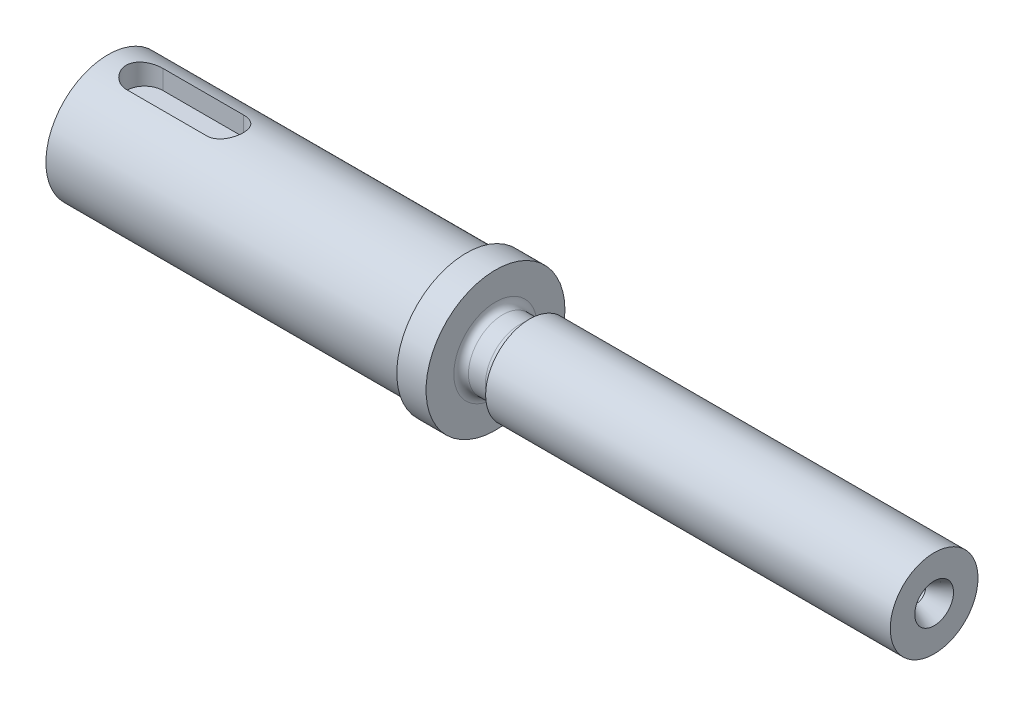
ISO-10303-21;
HEADER;
FILE_DESCRIPTION(('STEP AP214'),'2;1');
FILE_NAME('part.step','',(''),(''),'','','');
FILE_SCHEMA(('AUTOMOTIVE_DESIGN { 1 0 10303 214 1 1 1 1 }'));
ENDSEC;
DATA;
#1=APPLICATION_CONTEXT('core data for automotive mechanical design processes');
#2=APPLICATION_PROTOCOL_DEFINITION('international standard','automotive_design',2000,#1);
#3=PRODUCT_CONTEXT('',#1,'mechanical');
#4=PRODUCT('Part','Part','',(#3));
#5=PRODUCT_RELATED_PRODUCT_CATEGORY('part','',(#4));
#6=PRODUCT_DEFINITION_FORMATION('','',#4);
#7=PRODUCT_DEFINITION_CONTEXT('part definition',#1,'design');
#8=PRODUCT_DEFINITION('design','',#6,#7);
#9=PRODUCT_DEFINITION_SHAPE('','',#8);
#10=(LENGTH_UNIT() NAMED_UNIT(*) SI_UNIT(.MILLI.,.METRE.));
#11=(NAMED_UNIT(*) PLANE_ANGLE_UNIT() SI_UNIT($,.RADIAN.));
#12=(NAMED_UNIT(*) SI_UNIT($,.STERADIAN.) SOLID_ANGLE_UNIT());
#13=UNCERTAINTY_MEASURE_WITH_UNIT(LENGTH_MEASURE(1.E-05),#10,'distance_accuracy_value','');
#14=(GEOMETRIC_REPRESENTATION_CONTEXT(3) GLOBAL_UNCERTAINTY_ASSIGNED_CONTEXT((#13)) GLOBAL_UNIT_ASSIGNED_CONTEXT((#10,
#11,#12)) REPRESENTATION_CONTEXT('',''));
#15=CARTESIAN_POINT('',(0.,0.,0.));
#16=DIRECTION('',(0.,0.,1.));
#17=DIRECTION('',(1.,0.,0.));
#18=AXIS2_PLACEMENT_3D('',#15,#16,#17);
#19=CARTESIAN_POINT('',(0.,5.99999999999999,0.));
#20=DIRECTION('',(1.,0.,0.));
#21=DIRECTION('',(0.,0.,-1.));
#22=AXIS2_PLACEMENT_3D('',#19,#20,#21);
#23=PLANE('',#22);
#24=CARTESIAN_POINT('',(0.,0.,0.));
#25=DIRECTION('',(1.,0.,0.));
#26=DIRECTION('',(0.,0.,-1.));
#27=AXIS2_PLACEMENT_3D('',#24,#25,#26);
#28=CIRCLE('',#27,5.99999999999999);
#29=CARTESIAN_POINT('',(0.,0.,-5.99999999999999));
#30=VERTEX_POINT('',#29);
#31=EDGE_CURVE('E161',#30,#30,#28,.T.);
#32=ORIENTED_EDGE('',*,*,#31,.T.);
#33=EDGE_LOOP('',(#32));
#34=FACE_BOUND('',#33,.T.);
#35=CARTESIAN_POINT('',(0.,0.,0.));
#36=DIRECTION('',(1.,0.,0.));
#37=DIRECTION('',(0.,1.,0.));
#38=AXIS2_PLACEMENT_3D('',#35,#36,#37);
#39=CIRCLE('',#38,2.65);
#40=CARTESIAN_POINT('',(0.,2.65,0.));
#41=VERTEX_POINT('',#40);
#42=EDGE_CURVE('E209',#41,#41,#39,.T.);
#43=ORIENTED_EDGE('',*,*,#42,.F.);
#44=EDGE_LOOP('',(#43));
#45=FACE_BOUND('',#44,.T.);
#46=ADVANCED_FACE('F39',(#34,#45),#23,.T.);
#47=CARTESIAN_POINT('',(-113.,0.,0.));
#48=DIRECTION('',(-1.,0.,0.));
#49=DIRECTION('',(0.,0.,1.));
#50=AXIS2_PLACEMENT_3D('',#47,#48,#49);
#51=PLANE('',#50);
#52=CARTESIAN_POINT('',(-113.,0.,0.));
#53=DIRECTION('',(-1.,0.,0.));
#54=DIRECTION('',(0.,0.,1.));
#55=AXIS2_PLACEMENT_3D('',#52,#53,#54);
#56=CIRCLE('',#55,3.);
#57=CARTESIAN_POINT('',(-113.,0.,3.));
#58=VERTEX_POINT('',#57);
#59=EDGE_CURVE('E182',#58,#58,#56,.T.);
#60=ORIENTED_EDGE('',*,*,#59,.F.);
#61=EDGE_LOOP('',(#60));
#62=FACE_BOUND('',#61,.T.);
#63=CARTESIAN_POINT('',(-113.,0.,0.));
#64=DIRECTION('',(1.,0.,0.));
#65=DIRECTION('',(0.,0.,-1.));
#66=AXIS2_PLACEMENT_3D('',#63,#64,#65);
#67=CIRCLE('',#66,8.49999999999997);
#68=CARTESIAN_POINT('',(-113.,0.,-8.49999999999997));
#69=VERTEX_POINT('',#68);
#70=EDGE_CURVE('E145',#69,#69,#67,.T.);
#71=ORIENTED_EDGE('',*,*,#70,.F.);
#72=EDGE_LOOP('',(#71));
#73=FACE_BOUND('',#72,.T.);
#74=ADVANCED_FACE('F41',(#62,#73),#51,.T.);
#75=CARTESIAN_POINT('',(13.5135077391314,0.,0.));
#76=DIRECTION('',(1.,0.,0.));
#77=DIRECTION('',(0.,0.,-1.));
#78=AXIS2_PLACEMENT_3D('',#75,#76,#77);
#79=CYLINDRICAL_SURFACE('',#78,8.49999999999998);
#80=CARTESIAN_POINT('',(-97.,8.12403840463594,2.5));
#81=CARTESIAN_POINT('',(-96.9313201259835,8.12402906918785,2.50000849482376));
#82=CARTESIAN_POINT('',(-96.8626456449657,8.12490911076691,2.49717000278527));
#83=CARTESIAN_POINT('',(-96.7258194558498,8.12837858671622,2.48586511968106));
#84=CARTESIAN_POINT('',(-96.6576676373074,8.13096764928691,2.47739995270244));
#85=CARTESIAN_POINT('',(-96.5225348147538,8.13777747849975,2.45493539721691));
#86=CARTESIAN_POINT('',(-96.4555513436831,8.14199421689236,2.44094966934029));
#87=CARTESIAN_POINT('',(-96.3230738775093,8.15192355487621,2.40758038109888));
#88=CARTESIAN_POINT('',(-96.2575799189981,8.15763619117325,2.38819668828001));
#89=CARTESIAN_POINT('',(-96.0640533422837,8.17677139859332,2.32218333516284));
#90=CARTESIAN_POINT('',(-95.9388088556269,8.19220032894023,2.26766331260792));
#91=CARTESIAN_POINT('',(-95.6992474997711,8.22665400749429,2.13928827038699));
#92=CARTESIAN_POINT('',(-95.5849354746266,8.24568033865685,2.06542473351158));
#93=CARTESIAN_POINT('',(-95.3669772463586,8.28582980304433,1.89805567552886));
#94=CARTESIAN_POINT('',(-95.2637085442426,8.30699606932739,1.80406793699746));
#95=CARTESIAN_POINT('',(-95.0741487691324,8.34867230677748,1.60015164255654));
#96=CARTESIAN_POINT('',(-94.9878605418478,8.3691821674579,1.49022042007658));
#97=CARTESIAN_POINT('',(-94.8330701855369,8.40772509439059,1.25484557022573));
#98=CARTESIAN_POINT('',(-94.764954141379,8.42570106520508,1.12913784642324));
#99=CARTESIAN_POINT('',(-94.6509780084244,8.45664705558544,0.867439712870042));
#100=CARTESIAN_POINT('',(-94.6051123550013,8.46961832661635,0.731451883926505));
#101=CARTESIAN_POINT('',(-94.5381874024191,8.48878775104762,0.457025436042515));
#102=CARTESIAN_POINT('',(-94.5164794340767,8.49516267663221,0.318757581047494));
#103=CARTESIAN_POINT('',(-94.4964368330578,8.5010429046519,0.0404023337326122));
#104=CARTESIAN_POINT('',(-94.4980979642275,8.50054945212901,-0.0996847242177919));
#105=CARTESIAN_POINT('',(-94.5243079273843,8.49287404903275,-0.373152065700693));
#106=CARTESIAN_POINT('',(-94.5481541875526,8.48589741931876,-0.506606351501283));
#107=CARTESIAN_POINT('',(-94.6169118716277,8.46628787386656,-0.767526211609396));
#108=CARTESIAN_POINT('',(-94.6618243835128,8.45365466599275,-0.894991476236478));
#109=CARTESIAN_POINT('',(-94.7719271169139,8.42386367197649,-1.14201050505988));
#110=CARTESIAN_POINT('',(-94.8373420991287,8.40665607251671,-1.26145783196648));
#111=CARTESIAN_POINT('',(-94.9864155949324,8.36954730631602,-1.48790576816497));
#112=CARTESIAN_POINT('',(-95.0700780381101,8.34964555974155,-1.59490368885599));
#113=CARTESIAN_POINT('',(-95.2569208131668,8.30841337666868,-1.79760092163622));
#114=CARTESIAN_POINT('',(-95.3607089904058,8.2870573248578,-1.89273539157048));
#115=CARTESIAN_POINT('',(-95.5830040569046,8.24596689824957,-2.06442395091056));
#116=CARTESIAN_POINT('',(-95.701515171381,8.22623299169095,-2.14097268784054));
#117=CARTESIAN_POINT('',(-95.9513517897655,8.19049726651391,-2.27388499803612));
#118=CARTESIAN_POINT('',(-96.0827874583343,8.1745323433979,-2.33005169701785));
#119=CARTESIAN_POINT('',(-96.3537572683008,8.14859211524141,-2.41922275200857));
#120=CARTESIAN_POINT('',(-96.4932787191731,8.13860768891972,-2.45226239378341));
#121=CARTESIAN_POINT('',(-96.6950775793082,8.12953164409688,-2.48209216527632));
#122=CARTESIAN_POINT('',(-96.7558953391224,8.12747604590247,-2.48880708529662));
#123=CARTESIAN_POINT('',(-96.8777985330732,8.12472934803223,-2.49775684694221));
#124=CARTESIAN_POINT('',(-96.9388834298809,8.12403620932028,-2.49999838344214));
#125=CARTESIAN_POINT('',(-97.,8.12403840463594,-2.5));
#126=B_SPLINE_CURVE_WITH_KNOTS('',3,(#80,#81,#82,#83,#84,#85,#86,#87,#88,#89,#90,#91,#92,#93,
#94,#95,#96,#97,#98,#99,#100,#101,#102,#103,#104,#105,#106,#107,#108,#109,#110,#111,#112,#113,
#114,#115,#116,#117,#118,#119,#120,#121,#122,#123,#124,#125),.UNSPECIFIED.,.F.,.F.,(4,2,2,2,2,2,
2,2,2,2,2,2,2,2,2,2,2,2,2,2,2,2,4),(0.,0.205966154303675,0.411887515184557,0.617302486138783,
0.822722497965402,1.23305966556148,1.64357781480005,2.06533049675581,2.48715379896954,
2.91733102657664,3.3474006151165,3.76562050724646,4.18376458896797,4.58910158908383,
4.9944595253604,5.40442657694558,5.81448200221468,6.2397161669572,6.66507264934229,
7.09443475825321,7.52314033790763,7.70665727258005,7.88989934885716),.UNSPECIFIED.);
#127=CARTESIAN_POINT('',(-97.,8.12403840463594,2.5));
#128=VERTEX_POINT('',#127);
#129=CARTESIAN_POINT('',(-97.,8.12403840463594,-2.5));
#130=VERTEX_POINT('',#129);
#131=EDGE_CURVE('E131',#128,#130,#126,.T.);
#132=ORIENTED_EDGE('',*,*,#131,.F.);
#133=DIRECTION('',(1.,0.,0.));
#134=VECTOR('',#133,1.);
#135=CARTESIAN_POINT('',(13.5135077391314,8.12403840463594,2.5));
#136=LINE('',#135,#134);
#137=CARTESIAN_POINT('',(-108.,8.12403840463594,2.5));
#138=VERTEX_POINT('',#137);
#139=EDGE_CURVE('E11',#138,#128,#136,.T.);
#140=ORIENTED_EDGE('',*,*,#139,.F.);
#141=CARTESIAN_POINT('',(-108.,8.12403840463594,-2.5));
#142=CARTESIAN_POINT('',(-108.068679874016,8.12402906918785,-2.50000849482375));
#143=CARTESIAN_POINT('',(-108.137354355034,8.12490911076691,-2.49717000278526));
#144=CARTESIAN_POINT('',(-108.27418054415,8.12837858671622,-2.48586511968106));
#145=CARTESIAN_POINT('',(-108.342332362693,8.13096764928691,-2.47739995270243));
#146=CARTESIAN_POINT('',(-108.477465185246,8.13777747849975,-2.4549353972169));
#147=CARTESIAN_POINT('',(-108.544448656317,8.14199421689237,-2.44094966934028));
#148=CARTESIAN_POINT('',(-108.676926122491,8.15192355487621,-2.40758038109888));
#149=CARTESIAN_POINT('',(-108.742420081002,8.15763619117325,-2.38819668828));
#150=CARTESIAN_POINT('',(-108.935946657716,8.17677139859332,-2.32218333516283));
#151=CARTESIAN_POINT('',(-109.061191144373,8.19220032894023,-2.26766331260791));
#152=CARTESIAN_POINT('',(-109.300752500229,8.2266540074943,-2.13928827038698));
#153=CARTESIAN_POINT('',(-109.415064525373,8.24568033865686,-2.06542473351158));
#154=CARTESIAN_POINT('',(-109.633022753641,8.28582980304433,-1.89805567552886));
#155=CARTESIAN_POINT('',(-109.736291455757,8.30699606932739,-1.80406793699746));
#156=CARTESIAN_POINT('',(-109.925851230868,8.34867230677748,-1.60015164255653));
#157=CARTESIAN_POINT('',(-110.012139458152,8.3691821674579,-1.49022042007657));
#158=CARTESIAN_POINT('',(-110.166929814463,8.40772509439059,-1.25484557022572));
#159=CARTESIAN_POINT('',(-110.235045858621,8.42570106520508,-1.12913784642323));
#160=CARTESIAN_POINT('',(-110.349021991576,8.45664705558544,-0.867439712870033));
#161=CARTESIAN_POINT('',(-110.394887644999,8.46961832661636,-0.731451883926496));
#162=CARTESIAN_POINT('',(-110.461812597581,8.48878775104762,-0.457025436042506));
#163=CARTESIAN_POINT('',(-110.483520565923,8.49516267663221,-0.318757581047484));
#164=CARTESIAN_POINT('',(-110.503563166942,8.5010429046519,-0.0404023337326027));
#165=CARTESIAN_POINT('',(-110.501902035773,8.50054945212901,0.0996847242178012));
#166=CARTESIAN_POINT('',(-110.475692072616,8.49287404903275,0.3731520657007));
#167=CARTESIAN_POINT('',(-110.451845812447,8.48589741931876,0.50660635150129));
#168=CARTESIAN_POINT('',(-110.383088128372,8.46628787386656,0.767526211609402));
#169=CARTESIAN_POINT('',(-110.338175616487,8.45365466599275,0.894991476236485));
#170=CARTESIAN_POINT('',(-110.228072883086,8.42386367197649,1.14201050505989));
#171=CARTESIAN_POINT('',(-110.162657900871,8.40665607251671,1.26145783196649));
#172=CARTESIAN_POINT('',(-110.013584405068,8.36954730631602,1.48790576816497));
#173=CARTESIAN_POINT('',(-109.92992196189,8.34964555974155,1.59490368885599));
#174=CARTESIAN_POINT('',(-109.743079186833,8.30841337666867,1.79760092163623));
#175=CARTESIAN_POINT('',(-109.639291009594,8.2870573248578,1.89273539157049));
#176=CARTESIAN_POINT('',(-109.416995943095,8.24596689824957,2.06442395091057));
#177=CARTESIAN_POINT('',(-109.298484828619,8.22623299169095,2.14097268784055));
#178=CARTESIAN_POINT('',(-109.048648210234,8.19049726651391,2.27388499803613));
#179=CARTESIAN_POINT('',(-108.917212541666,8.17453234339789,2.33005169701786));
#180=CARTESIAN_POINT('',(-108.646242731699,8.1485921152414,2.41922275200858));
#181=CARTESIAN_POINT('',(-108.506721280827,8.13860768891972,2.45226239378342));
#182=CARTESIAN_POINT('',(-108.304922420692,8.12953164409688,2.48209216527632));
#183=CARTESIAN_POINT('',(-108.244104660878,8.12747604590247,2.48880708529663));
#184=CARTESIAN_POINT('',(-108.122201466927,8.12472934803223,2.49775684694221));
#185=CARTESIAN_POINT('',(-108.061116570119,8.12403620932028,2.49999838344215));
#186=CARTESIAN_POINT('',(-108.,8.12403840463594,2.5));
#187=B_SPLINE_CURVE_WITH_KNOTS('',3,(#141,#142,#143,#144,#145,#146,#147,#148,#149,#150,#151,
#152,#153,#154,#155,#156,#157,#158,#159,#160,#161,#162,#163,#164,#165,#166,#167,#168,#169,#170,
#171,#172,#173,#174,#175,#176,#177,#178,#179,#180,#181,#182,#183,#184,#185,#186),.UNSPECIFIED.,
.F.,.F.,(4,2,2,2,2,2,2,2,2,2,2,2,2,2,2,2,2,2,2,2,2,2,4),(0.,0.205966154303661,0.411887515184542,
0.617302486138783,0.822722497965402,1.23305966556148,1.64357781480004,2.06533049675579,
2.48715379896954,2.91733102657664,3.3474006151165,3.76562050724646,4.18376458896797,
4.58910158908383,4.9944595253604,5.40442657694558,5.81448200221468,6.2397161669572,
6.66507264934229,7.09443475825322,7.52314033790764,7.70665727258005,7.88989934885716),.UNSPECIFIED.);
#188=CARTESIAN_POINT('',(-108.,8.12403840463594,-2.5));
#189=VERTEX_POINT('',#188);
#190=EDGE_CURVE('E47',#189,#138,#187,.T.);
#191=ORIENTED_EDGE('',*,*,#190,.F.);
#192=DIRECTION('',(1.,0.,0.));
#193=VECTOR('',#192,1.);
#194=CARTESIAN_POINT('',(13.5135077391314,8.12403840463594,-2.50000000000001));
#195=LINE('',#194,#193);
#196=EDGE_CURVE('E141',#130,#189,#195,.F.);
#197=ORIENTED_EDGE('',*,*,#196,.F.);
#198=EDGE_LOOP('',(#132,#140,#191,#197));
#199=FACE_BOUND('',#198,.T.);
#200=ORIENTED_EDGE('',*,*,#70,.T.);
#201=EDGE_LOOP('',(#200));
#202=FACE_BOUND('',#201,.T.);
#203=CARTESIAN_POINT('',(-64.,0.,0.));
#204=DIRECTION('',(1.,0.,0.));
#205=DIRECTION('',(0.,0.,-1.));
#206=AXIS2_PLACEMENT_3D('',#203,#204,#205);
#207=CIRCLE('',#206,8.49999999999999);
#208=CARTESIAN_POINT('',(-64.,0.,-8.49999999999999));
#209=VERTEX_POINT('',#208);
#210=EDGE_CURVE('E149',#209,#209,#207,.T.);
#211=ORIENTED_EDGE('',*,*,#210,.F.);
#212=EDGE_LOOP('',(#211));
#213=FACE_BOUND('',#212,.T.);
#214=ADVANCED_FACE('F102',(#199,#202,#213),#79,.T.);
#215=CARTESIAN_POINT('',(-64.,8.49999999999999,0.));
#216=DIRECTION('',(-1.,0.,0.));
#217=DIRECTION('',(0.,0.,1.));
#218=AXIS2_PLACEMENT_3D('',#215,#216,#217);
#219=PLANE('',#218);
#220=ORIENTED_EDGE('',*,*,#210,.T.);
#221=EDGE_LOOP('',(#220));
#222=FACE_BOUND('',#221,.T.);
#223=CARTESIAN_POINT('',(-64.,0.,0.));
#224=DIRECTION('',(1.,0.,0.));
#225=DIRECTION('',(0.,0.,-1.));
#226=AXIS2_PLACEMENT_3D('',#223,#224,#225);
#227=CIRCLE('',#226,9.49999999999999);
#228=CARTESIAN_POINT('',(-64.,0.,-9.49999999999999));
#229=VERTEX_POINT('',#228);
#230=EDGE_CURVE('E153',#229,#229,#227,.T.);
#231=ORIENTED_EDGE('',*,*,#230,.F.);
#232=EDGE_LOOP('',(#231));
#233=FACE_BOUND('',#232,.T.);
#234=ADVANCED_FACE('F123',(#222,#233),#219,.T.);
#235=CARTESIAN_POINT('',(13.5135077391314,0.,0.));
#236=DIRECTION('',(1.,0.,0.));
#237=DIRECTION('',(0.,0.,-1.));
#238=AXIS2_PLACEMENT_3D('',#235,#236,#237);
#239=CYLINDRICAL_SURFACE('',#238,9.49999999999999);
#240=ORIENTED_EDGE('',*,*,#230,.T.);
#241=EDGE_LOOP('',(#240));
#242=FACE_BOUND('',#241,.T.);
#243=CARTESIAN_POINT('',(-60.,0.,0.));
#244=DIRECTION('',(1.,0.,0.));
#245=DIRECTION('',(0.,0.,-1.));
#246=AXIS2_PLACEMENT_3D('',#243,#244,#245);
#247=CIRCLE('',#246,9.49999999999999);
#248=CARTESIAN_POINT('',(-60.,0.,-9.49999999999999));
#249=VERTEX_POINT('',#248);
#250=EDGE_CURVE('E158',#249,#249,#247,.T.);
#251=ORIENTED_EDGE('',*,*,#250,.F.);
#252=EDGE_LOOP('',(#251));
#253=FACE_BOUND('',#252,.T.);
#254=ADVANCED_FACE('F119',(#242,#253),#239,.T.);
#255=CARTESIAN_POINT('',(-60.,9.49999999999999,0.));
#256=DIRECTION('',(1.,0.,0.));
#257=DIRECTION('',(0.,0.,-1.));
#258=AXIS2_PLACEMENT_3D('',#255,#256,#257);
#259=PLANE('',#258);
#260=ORIENTED_EDGE('',*,*,#250,.T.);
#261=EDGE_LOOP('',(#260));
#262=FACE_BOUND('',#261,.T.);
#263=CARTESIAN_POINT('',(-60.,0.,0.));
#264=DIRECTION('',(-1.,0.,0.));
#265=DIRECTION('',(0.,0.,1.));
#266=AXIS2_PLACEMENT_3D('',#263,#264,#265);
#267=CIRCLE('',#266,5.7);
#268=CARTESIAN_POINT('',(-60.,0.,5.7));
#269=VERTEX_POINT('',#268);
#270=EDGE_CURVE('E203',#269,#269,#267,.T.);
#271=ORIENTED_EDGE('',*,*,#270,.T.);
#272=EDGE_LOOP('',(#271));
#273=FACE_BOUND('',#272,.T.);
#274=ADVANCED_FACE('F116',(#262,#273),#259,.T.);
#275=CARTESIAN_POINT('',(-108.,5.5,0.));
#276=DIRECTION('',(0.,1.,0.));
#277=DIRECTION('',(0.,0.,1.));
#278=AXIS2_PLACEMENT_3D('',#275,#276,#277);
#279=CYLINDRICAL_SURFACE('',#278,2.5);
#280=DIRECTION('',(0.,1.,0.));
#281=VECTOR('',#280,1.);
#282=CARTESIAN_POINT('',(-108.,5.5,-2.5));
#283=LINE('',#282,#281);
#284=CARTESIAN_POINT('',(-108.,5.5,-2.5));
#285=VERTEX_POINT('',#284);
#286=EDGE_CURVE('E163',#285,#189,#283,.T.);
#287=ORIENTED_EDGE('',*,*,#286,.T.);
#288=ORIENTED_EDGE('',*,*,#190,.T.);
#289=DIRECTION('',(0.,1.,0.));
#290=VECTOR('',#289,1.);
#291=CARTESIAN_POINT('',(-108.,5.5,2.5));
#292=LINE('',#291,#290);
#293=CARTESIAN_POINT('',(-108.,5.5,2.5));
#294=VERTEX_POINT('',#293);
#295=EDGE_CURVE('E53',#294,#138,#292,.T.);
#296=ORIENTED_EDGE('',*,*,#295,.F.);
#297=CARTESIAN_POINT('',(-108.,5.5,0.));
#298=DIRECTION('',(0.,1.,0.));
#299=DIRECTION('',(0.,0.,-1.));
#300=AXIS2_PLACEMENT_3D('',#297,#298,#299);
#301=CIRCLE('',#300,2.5);
#302=EDGE_CURVE('E179',#285,#294,#301,.T.);
#303=ORIENTED_EDGE('',*,*,#302,.F.);
#304=EDGE_LOOP('',(#287,#288,#296,#303));
#305=FACE_BOUND('',#304,.T.);
#306=ADVANCED_FACE('F108',(#305),#279,.F.);
#307=CARTESIAN_POINT('',(-108.,5.5,-2.5));
#308=DIRECTION('',(0.,0.,-1.));
#309=DIRECTION('',(-1.,0.,0.));
#310=AXIS2_PLACEMENT_3D('',#307,#308,#309);
#311=PLANE('',#310);
#312=ORIENTED_EDGE('',*,*,#196,.T.);
#313=ORIENTED_EDGE('',*,*,#286,.F.);
#314=DIRECTION('',(-1.,0.,0.));
#315=VECTOR('',#314,1.);
#316=CARTESIAN_POINT('',(-108.,5.5,-2.5));
#317=LINE('',#316,#315);
#318=CARTESIAN_POINT('',(-97.,5.5,-2.5));
#319=VERTEX_POINT('',#318);
#320=EDGE_CURVE('E166',#319,#285,#317,.T.);
#321=ORIENTED_EDGE('',*,*,#320,.F.);
#322=DIRECTION('',(0.,1.,0.));
#323=VECTOR('',#322,1.);
#324=CARTESIAN_POINT('',(-97.,5.5,-2.5));
#325=LINE('',#324,#323);
#326=EDGE_CURVE('E168',#319,#130,#325,.T.);
#327=ORIENTED_EDGE('',*,*,#326,.T.);
#328=EDGE_LOOP('',(#312,#313,#321,#327));
#329=FACE_BOUND('',#328,.T.);
#330=ADVANCED_FACE('F253',(#329),#311,.F.);
#331=CARTESIAN_POINT('',(-97.,5.5,0.));
#332=DIRECTION('',(0.,1.,0.));
#333=DIRECTION('',(0.,0.,1.));
#334=AXIS2_PLACEMENT_3D('',#331,#332,#333);
#335=CYLINDRICAL_SURFACE('',#334,2.5);
#336=DIRECTION('',(0.,1.,0.));
#337=VECTOR('',#336,1.);
#338=CARTESIAN_POINT('',(-97.,5.5,2.5));
#339=LINE('',#338,#337);
#340=CARTESIAN_POINT('',(-97.,5.5,2.5));
#341=VERTEX_POINT('',#340);
#342=EDGE_CURVE('E165',#341,#128,#339,.T.);
#343=ORIENTED_EDGE('',*,*,#342,.T.);
#344=ORIENTED_EDGE('',*,*,#131,.T.);
#345=ORIENTED_EDGE('',*,*,#326,.F.);
#346=CARTESIAN_POINT('',(-97.,5.5,0.));
#347=DIRECTION('',(0.,1.,0.));
#348=DIRECTION('',(0.,0.,1.));
#349=AXIS2_PLACEMENT_3D('',#346,#347,#348);
#350=CIRCLE('',#349,2.5);
#351=EDGE_CURVE('E173',#341,#319,#350,.T.);
#352=ORIENTED_EDGE('',*,*,#351,.F.);
#353=EDGE_LOOP('',(#343,#344,#345,#352));
#354=FACE_BOUND('',#353,.T.);
#355=ADVANCED_FACE('F255',(#354),#335,.F.);
#356=CARTESIAN_POINT('',(-108.,5.5,2.5));
#357=DIRECTION('',(0.,0.,1.));
#358=DIRECTION('',(1.,0.,0.));
#359=AXIS2_PLACEMENT_3D('',#356,#357,#358);
#360=PLANE('',#359);
#361=ORIENTED_EDGE('',*,*,#139,.T.);
#362=ORIENTED_EDGE('',*,*,#342,.F.);
#363=DIRECTION('',(1.,0.,0.));
#364=VECTOR('',#363,1.);
#365=CARTESIAN_POINT('',(-108.,5.5,2.5));
#366=LINE('',#365,#364);
#367=EDGE_CURVE('E176',#294,#341,#366,.T.);
#368=ORIENTED_EDGE('',*,*,#367,.F.);
#369=ORIENTED_EDGE('',*,*,#295,.T.);
#370=EDGE_LOOP('',(#361,#362,#368,#369));
#371=FACE_BOUND('',#370,.T.);
#372=ADVANCED_FACE('F251',(#371),#360,.F.);
#373=CARTESIAN_POINT('',(-108.,5.5,0.));
#374=DIRECTION('',(0.,-1.,0.));
#375=DIRECTION('',(0.,0.,-1.));
#376=AXIS2_PLACEMENT_3D('',#373,#374,#375);
#377=PLANE('',#376);
#378=ORIENTED_EDGE('',*,*,#302,.T.);
#379=ORIENTED_EDGE('',*,*,#367,.T.);
#380=ORIENTED_EDGE('',*,*,#351,.T.);
#381=ORIENTED_EDGE('',*,*,#320,.T.);
#382=EDGE_LOOP('',(#378,#379,#380,#381));
#383=FACE_BOUND('',#382,.T.);
#384=ADVANCED_FACE('F247',(#383),#377,.F.);
#385=CARTESIAN_POINT('',(-113.,0.,0.));
#386=DIRECTION('',(-1.,0.,0.));
#387=DIRECTION('',(0.,0.,1.));
#388=AXIS2_PLACEMENT_3D('',#385,#386,#387);
#389=CONICAL_SURFACE('',#388,3.,0.785398163397451);
#390=CARTESIAN_POINT('',(-112.5,0.,0.));
#391=DIRECTION('',(-1.,0.,0.));
#392=DIRECTION('',(0.,0.,1.));
#393=AXIS2_PLACEMENT_3D('',#390,#391,#392);
#394=CIRCLE('',#393,2.5);
#395=CARTESIAN_POINT('',(-112.5,0.,2.5));
#396=VERTEX_POINT('',#395);
#397=EDGE_CURVE('E185',#396,#396,#394,.T.);
#398=ORIENTED_EDGE('',*,*,#397,.F.);
#399=EDGE_LOOP('',(#398));
#400=FACE_BOUND('',#399,.T.);
#401=ORIENTED_EDGE('',*,*,#59,.T.);
#402=EDGE_LOOP('',(#401));
#403=FACE_BOUND('',#402,.T.);
#404=ADVANCED_FACE('F243',(#400,#403),#389,.F.);
#405=CARTESIAN_POINT('',(-113.,0.,0.));
#406=DIRECTION('',(-1.,0.,0.));
#407=DIRECTION('',(0.,0.,1.));
#408=AXIS2_PLACEMENT_3D('',#405,#406,#407);
#409=CYLINDRICAL_SURFACE('',#408,2.5);
#410=CARTESIAN_POINT('',(-93.,0.,0.));
#411=DIRECTION('',(-1.,0.,0.));
#412=DIRECTION('',(0.,0.,1.));
#413=AXIS2_PLACEMENT_3D('',#410,#411,#412);
#414=CIRCLE('',#413,2.5);
#415=CARTESIAN_POINT('',(-93.,0.,2.5));
#416=VERTEX_POINT('',#415);
#417=EDGE_CURVE('E188',#416,#416,#414,.T.);
#418=ORIENTED_EDGE('',*,*,#417,.F.);
#419=EDGE_LOOP('',(#418));
#420=FACE_BOUND('',#419,.T.);
#421=ORIENTED_EDGE('',*,*,#397,.T.);
#422=EDGE_LOOP('',(#421));
#423=FACE_BOUND('',#422,.T.);
#424=ADVANCED_FACE('F239',(#420,#423),#409,.F.);
#425=CARTESIAN_POINT('',(-93.,0.,0.));
#426=DIRECTION('',(-1.,0.,0.));
#427=DIRECTION('',(0.,0.,1.));
#428=AXIS2_PLACEMENT_3D('',#425,#426,#427);
#429=CONICAL_SURFACE('',#428,2.5,1.02974425867665);
#430=CARTESIAN_POINT('',(-91.4978484524311,0.,0.));
#431=VERTEX_POINT('',#430);
#432=VERTEX_LOOP('',#431);
#433=FACE_BOUND('',#432,.T.);
#434=ORIENTED_EDGE('',*,*,#417,.T.);
#435=EDGE_LOOP('',(#434));
#436=FACE_BOUND('',#435,.T.);
#437=ADVANCED_FACE('F235',(#433,#436),#429,.F.);
#438=CARTESIAN_POINT('',(-55.3494446500535,0.,0.));
#439=DIRECTION('',(1.,0.,0.));
#440=DIRECTION('',(0.,0.,-1.));
#441=AXIS2_PLACEMENT_3D('',#438,#439,#440);
#442=CONICAL_SURFACE('',#441,6.,1.0471975511966);
#443=CARTESIAN_POINT('',(-55.8113248654052,0.,0.));
#444=DIRECTION('',(-1.,0.,0.));
#445=DIRECTION('',(0.,0.,1.));
#446=AXIS2_PLACEMENT_3D('',#443,#444,#445);
#447=CIRCLE('',#446,5.2);
#448=CARTESIAN_POINT('',(-55.8113248654052,0.,5.2));
#449=VERTEX_POINT('',#448);
#450=EDGE_CURVE('E194',#449,#449,#447,.T.);
#451=ORIENTED_EDGE('',*,*,#450,.F.);
#452=EDGE_LOOP('',(#451));
#453=FACE_BOUND('',#452,.T.);
#454=CARTESIAN_POINT('',(-55.3494446500535,0.,0.));
#455=DIRECTION('',(-1.,0.,0.));
#456=DIRECTION('',(0.,0.,1.));
#457=AXIS2_PLACEMENT_3D('',#454,#455,#456);
#458=CIRCLE('',#457,6.);
#459=CARTESIAN_POINT('',(-55.3494446500535,0.,6.));
#460=VERTEX_POINT('',#459);
#461=EDGE_CURVE('E191',#460,#460,#458,.T.);
#462=ORIENTED_EDGE('',*,*,#461,.T.);
#463=EDGE_LOOP('',(#462));
#464=FACE_BOUND('',#463,.T.);
#465=ADVANCED_FACE('F231',(#453,#464),#442,.T.);
#466=CARTESIAN_POINT('',(-56.6773502691896,0.,0.));
#467=DIRECTION('',(-1.,0.,0.));
#468=DIRECTION('',(0.,0.,1.));
#469=AXIS2_PLACEMENT_3D('',#466,#467,#468);
#470=TOROIDAL_SURFACE('',#469,5.7,0.999999999999998);
#471=CARTESIAN_POINT('',(-56.6773502691896,0.,0.));
#472=DIRECTION('',(-1.,0.,0.));
#473=DIRECTION('',(0.,0.,1.));
#474=AXIS2_PLACEMENT_3D('',#471,#472,#473);
#475=CIRCLE('',#474,4.7);
#476=CARTESIAN_POINT('',(-56.6773502691896,0.,4.7));
#477=VERTEX_POINT('',#476);
#478=EDGE_CURVE('E197',#477,#477,#475,.T.);
#479=ORIENTED_EDGE('',*,*,#478,.F.);
#480=EDGE_LOOP('',(#479));
#481=FACE_BOUND('',#480,.T.);
#482=ORIENTED_EDGE('',*,*,#450,.T.);
#483=EDGE_LOOP('',(#482));
#484=FACE_BOUND('',#483,.T.);
#485=ADVANCED_FACE('F227',(#481,#484),#470,.F.);
#486=CARTESIAN_POINT('',(-73.6771862029483,0.,0.));
#487=DIRECTION('',(-1.,0.,0.));
#488=DIRECTION('',(0.,0.,1.));
#489=AXIS2_PLACEMENT_3D('',#486,#487,#488);
#490=CYLINDRICAL_SURFACE('',#489,4.7);
#491=CARTESIAN_POINT('',(-59.,0.,0.));
#492=DIRECTION('',(-1.,0.,0.));
#493=DIRECTION('',(0.,0.,1.));
#494=AXIS2_PLACEMENT_3D('',#491,#492,#493);
#495=CIRCLE('',#494,4.7);
#496=CARTESIAN_POINT('',(-59.,0.,4.7));
#497=VERTEX_POINT('',#496);
#498=EDGE_CURVE('E200',#497,#497,#495,.T.);
#499=ORIENTED_EDGE('',*,*,#498,.F.);
#500=EDGE_LOOP('',(#499));
#501=FACE_BOUND('',#500,.T.);
#502=ORIENTED_EDGE('',*,*,#478,.T.);
#503=EDGE_LOOP('',(#502));
#504=FACE_BOUND('',#503,.T.);
#505=ADVANCED_FACE('F223',(#501,#504),#490,.T.);
#506=CARTESIAN_POINT('',(-59.,0.,0.));
#507=DIRECTION('',(-1.,0.,0.));
#508=DIRECTION('',(0.,0.,1.));
#509=AXIS2_PLACEMENT_3D('',#506,#507,#508);
#510=TOROIDAL_SURFACE('',#509,5.7,1.);
#511=ORIENTED_EDGE('',*,*,#270,.F.);
#512=EDGE_LOOP('',(#511));
#513=FACE_BOUND('',#512,.T.);
#514=ORIENTED_EDGE('',*,*,#498,.T.);
#515=EDGE_LOOP('',(#514));
#516=FACE_BOUND('',#515,.T.);
#517=ADVANCED_FACE('F114',(#513,#516),#510,.F.);
#518=CARTESIAN_POINT('',(13.5135077391314,0.,0.));
#519=DIRECTION('',(1.,0.,0.));
#520=DIRECTION('',(0.,0.,-1.));
#521=AXIS2_PLACEMENT_3D('',#518,#519,#520);
#522=CYLINDRICAL_SURFACE('',#521,5.99999999999999);
#523=ORIENTED_EDGE('',*,*,#461,.F.);
#524=EDGE_LOOP('',(#523));
#525=FACE_BOUND('',#524,.T.);
#526=ORIENTED_EDGE('',*,*,#31,.F.);
#527=EDGE_LOOP('',(#526));
#528=FACE_BOUND('',#527,.T.);
#529=ADVANCED_FACE('F111',(#525,#528),#522,.T.);
#530=CARTESIAN_POINT('',(0.,0.,0.));
#531=DIRECTION('',(1.,0.,0.));
#532=DIRECTION('',(0.,1.,0.));
#533=AXIS2_PLACEMENT_3D('',#530,#531,#532);
#534=CYLINDRICAL_SURFACE('',#533,1.25);
#535=CARTESIAN_POINT('',(-2.42487113059646,0.,0.));
#536=DIRECTION('',(1.,0.,0.));
#537=DIRECTION('',(0.,1.,0.));
#538=AXIS2_PLACEMENT_3D('',#535,#536,#537);
#539=CIRCLE('',#538,1.25);
#540=CARTESIAN_POINT('',(-2.42487113059646,1.25,0.));
#541=VERTEX_POINT('',#540);
#542=EDGE_CURVE('E206',#541,#541,#539,.T.);
#543=ORIENTED_EDGE('',*,*,#542,.T.);
#544=EDGE_LOOP('',(#543));
#545=FACE_BOUND('',#544,.T.);
#546=CARTESIAN_POINT('',(-4.6,0.,0.));
#547=DIRECTION('',(1.,0.,0.));
#548=DIRECTION('',(0.,1.,0.));
#549=AXIS2_PLACEMENT_3D('',#546,#547,#548);
#550=CIRCLE('',#549,1.25);
#551=CARTESIAN_POINT('',(-4.6,1.25,0.));
#552=VERTEX_POINT('',#551);
#553=EDGE_CURVE('E212',#552,#552,#550,.T.);
#554=ORIENTED_EDGE('',*,*,#553,.F.);
#555=EDGE_LOOP('',(#554));
#556=FACE_BOUND('',#555,.T.);
#557=ADVANCED_FACE('F92',(#545,#556),#534,.F.);
#558=CARTESIAN_POINT('',(-2.42487113059646,0.,0.));
#559=DIRECTION('',(1.,0.,0.));
#560=DIRECTION('',(0.,1.,0.));
#561=AXIS2_PLACEMENT_3D('',#558,#559,#560);
#562=CONICAL_SURFACE('',#561,1.25,0.523598775598293);
#563=ORIENTED_EDGE('',*,*,#42,.T.);
#564=EDGE_LOOP('',(#563));
#565=FACE_BOUND('',#564,.T.);
#566=ORIENTED_EDGE('',*,*,#542,.F.);
#567=EDGE_LOOP('',(#566));
#568=FACE_BOUND('',#567,.T.);
#569=ADVANCED_FACE('F86',(#565,#568),#562,.F.);
#570=CARTESIAN_POINT('',(-5.35107577378446,0.,0.));
#571=DIRECTION('',(1.,0.,0.));
#572=DIRECTION('',(0.,1.,0.));
#573=AXIS2_PLACEMENT_3D('',#570,#571,#572);
#574=CONICAL_SURFACE('',#573,0.,1.02974425867665);
#575=ORIENTED_EDGE('',*,*,#553,.T.);
#576=EDGE_LOOP('',(#575));
#577=FACE_BOUND('',#576,.T.);
#578=CARTESIAN_POINT('',(-5.35107577378446,0.,0.));
#579=VERTEX_POINT('',#578);
#580=VERTEX_LOOP('',#579);
#581=FACE_BOUND('',#580,.T.);
#582=ADVANCED_FACE('F84',(#577,#581),#574,.F.);
#583=CLOSED_SHELL('',(#46,#74,#214,#234,#254,#274,#306,#330,#355,#372,#384,#404,#424,#437,#465,
#485,#505,#517,#529,#557,#569,#582));
#584=MANIFOLD_SOLID_BREP('B2',#583);
#585=ADVANCED_BREP_SHAPE_REPRESENTATION('',(#18,#584),#14);
#586=SHAPE_DEFINITION_REPRESENTATION(#9,#585);
ENDSEC;
END-ISO-10303-21;
